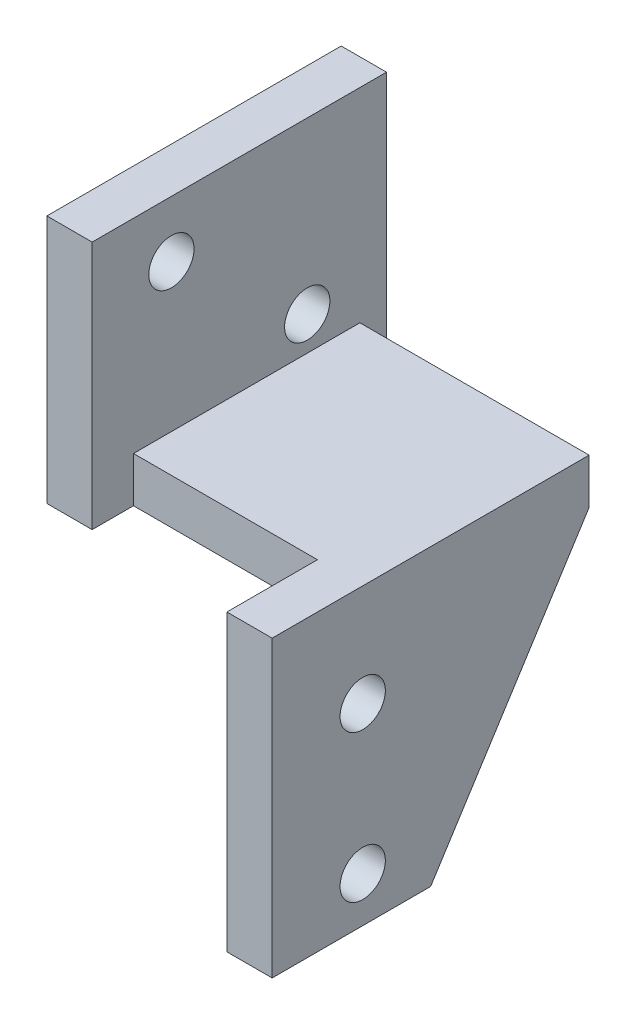
ISO-10303-21;
HEADER;
FILE_DESCRIPTION(('STEP AP214'),'2;1');
FILE_NAME('part.step','',(''),(''),'','','');
FILE_SCHEMA(('AUTOMOTIVE_DESIGN { 1 0 10303 214 1 1 1 1 }'));
ENDSEC;
DATA;
#1=APPLICATION_CONTEXT('core data for automotive mechanical design processes');
#2=APPLICATION_PROTOCOL_DEFINITION('international standard','automotive_design',2000,#1);
#3=PRODUCT_CONTEXT('',#1,'mechanical');
#4=PRODUCT('Part','Part','',(#3));
#5=PRODUCT_RELATED_PRODUCT_CATEGORY('part','',(#4));
#6=PRODUCT_DEFINITION_FORMATION('','',#4);
#7=PRODUCT_DEFINITION_CONTEXT('part definition',#1,'design');
#8=PRODUCT_DEFINITION('design','',#6,#7);
#9=PRODUCT_DEFINITION_SHAPE('','',#8);
#10=(LENGTH_UNIT() NAMED_UNIT(*) SI_UNIT(.MILLI.,.METRE.));
#11=(NAMED_UNIT(*) PLANE_ANGLE_UNIT() SI_UNIT($,.RADIAN.));
#12=(NAMED_UNIT(*) SI_UNIT($,.STERADIAN.) SOLID_ANGLE_UNIT());
#13=UNCERTAINTY_MEASURE_WITH_UNIT(LENGTH_MEASURE(1.E-05),#10,'distance_accuracy_value','');
#14=(GEOMETRIC_REPRESENTATION_CONTEXT(3) GLOBAL_UNCERTAINTY_ASSIGNED_CONTEXT((#13)) GLOBAL_UNIT_ASSIGNED_CONTEXT((#10,
#11,#12)) REPRESENTATION_CONTEXT('',''));
#15=CARTESIAN_POINT('',(0.,0.,0.));
#16=DIRECTION('',(0.,0.,1.));
#17=DIRECTION('',(1.,0.,0.));
#18=AXIS2_PLACEMENT_3D('',#15,#16,#17);
#19=CARTESIAN_POINT('',(0.,0.,20.));
#20=DIRECTION('',(0.,0.,1.));
#21=DIRECTION('',(1.,0.,0.));
#22=AXIS2_PLACEMENT_3D('',#19,#20,#21);
#23=PLANE('',#22);
#24=DIRECTION('',(1.,0.,0.));
#25=VECTOR('',#24,1.);
#26=CARTESIAN_POINT('',(0.,-2.,20.));
#27=LINE('',#26,#25);
#28=CARTESIAN_POINT('',(4.,-2.,20.));
#29=VERTEX_POINT('',#28);
#30=CARTESIAN_POINT('',(20.25,-2.,20.));
#31=VERTEX_POINT('',#30);
#32=EDGE_CURVE('E175',#29,#31,#27,.T.);
#33=ORIENTED_EDGE('',*,*,#32,.T.);
#34=DIRECTION('',(0.,-1.,0.));
#35=VECTOR('',#34,1.);
#36=CARTESIAN_POINT('',(20.25,-24.,20.));
#37=LINE('',#36,#35);
#38=CARTESIAN_POINT('',(20.25,2.,20.));
#39=VERTEX_POINT('',#38);
#40=EDGE_CURVE('E249',#39,#31,#37,.T.);
#41=ORIENTED_EDGE('',*,*,#40,.F.);
#42=DIRECTION('',(1.,0.,0.));
#43=VECTOR('',#42,1.);
#44=CARTESIAN_POINT('',(0.,2.,20.));
#45=LINE('',#44,#43);
#46=CARTESIAN_POINT('',(4.,2.,20.));
#47=VERTEX_POINT('',#46);
#48=EDGE_CURVE('E172',#47,#39,#45,.T.);
#49=ORIENTED_EDGE('',*,*,#48,.F.);
#50=DIRECTION('',(0.,1.,0.));
#51=VECTOR('',#50,1.);
#52=CARTESIAN_POINT('',(4.,16.,20.));
#53=LINE('',#52,#51);
#54=EDGE_CURVE('E243',#29,#47,#53,.T.);
#55=ORIENTED_EDGE('',*,*,#54,.F.);
#56=EDGE_LOOP('',(#33,#41,#49,#55));
#57=FACE_BOUND('',#56,.T.);
#58=ADVANCED_FACE('F43',(#57),#23,.T.);
#59=CARTESIAN_POINT('',(4.,0.,20.));
#60=DIRECTION('',(1.,0.,0.));
#61=DIRECTION('',(0.,1.,0.));
#62=AXIS2_PLACEMENT_3D('',#59,#60,#61);
#63=PLANE('',#62);
#64=CARTESIAN_POINT('',(4.,15.,16.65));
#65=DIRECTION('',(1.,0.,0.));
#66=DIRECTION('',(0.,1.,0.));
#67=AXIS2_PLACEMENT_3D('',#64,#65,#66);
#68=CIRCLE('',#67,2.);
#69=CARTESIAN_POINT('',(4.,17.,16.65));
#70=VERTEX_POINT('',#69);
#71=EDGE_CURVE('E241',#70,#70,#68,.T.);
#72=ORIENTED_EDGE('',*,*,#71,.F.);
#73=EDGE_LOOP('',(#72));
#74=FACE_BOUND('',#73,.T.);
#75=DIRECTION('',(0.,1.,0.));
#76=VECTOR('',#75,1.);
#77=CARTESIAN_POINT('',(4.,0.,-2.35));
#78=LINE('',#77,#76);
#79=CARTESIAN_POINT('',(4.,-2.,-2.35));
#80=VERTEX_POINT('',#79);
#81=CARTESIAN_POINT('',(4.,20.,-2.35));
#82=VERTEX_POINT('',#81);
#83=EDGE_CURVE('E65',#80,#82,#78,.T.);
#84=ORIENTED_EDGE('',*,*,#83,.T.);
#85=DIRECTION('',(0.,0.,-1.));
#86=VECTOR('',#85,1.);
#87=CARTESIAN_POINT('',(4.,20.,-2.35));
#88=LINE('',#87,#86);
#89=CARTESIAN_POINT('',(4.,20.,23.65));
#90=VERTEX_POINT('',#89);
#91=EDGE_CURVE('E205',#90,#82,#88,.T.);
#92=ORIENTED_EDGE('',*,*,#91,.F.);
#93=DIRECTION('',(0.,1.,0.));
#94=VECTOR('',#93,1.);
#95=CARTESIAN_POINT('',(4.,0.,23.65));
#96=LINE('',#95,#94);
#97=CARTESIAN_POINT('',(4.,-2.,23.65));
#98=VERTEX_POINT('',#97);
#99=EDGE_CURVE('E207',#98,#90,#96,.T.);
#100=ORIENTED_EDGE('',*,*,#99,.F.);
#101=DIRECTION('',(0.,0.,-1.));
#102=VECTOR('',#101,1.);
#103=CARTESIAN_POINT('',(4.,-2.,40.));
#104=LINE('',#103,#102);
#105=EDGE_CURVE('E167',#98,#29,#104,.T.);
#106=ORIENTED_EDGE('',*,*,#105,.T.);
#107=ORIENTED_EDGE('',*,*,#54,.T.);
#108=DIRECTION('',(0.,0.,-1.));
#109=VECTOR('',#108,1.);
#110=CARTESIAN_POINT('',(4.,2.,20.));
#111=LINE('',#110,#109);
#112=CARTESIAN_POINT('',(4.,2.,0.));
#113=VERTEX_POINT('',#112);
#114=EDGE_CURVE('E157',#47,#113,#111,.T.);
#115=ORIENTED_EDGE('',*,*,#114,.T.);
#116=DIRECTION('',(0.,-1.,0.));
#117=VECTOR('',#116,1.);
#118=CARTESIAN_POINT('',(4.,16.,0.));
#119=LINE('',#118,#117);
#120=CARTESIAN_POINT('',(4.,-2.,0.));
#121=VERTEX_POINT('',#120);
#122=EDGE_CURVE('E51',#113,#121,#119,.T.);
#123=ORIENTED_EDGE('',*,*,#122,.T.);
#124=DIRECTION('',(0.,0.,1.));
#125=VECTOR('',#124,1.);
#126=CARTESIAN_POINT('',(4.,-2.,-20.));
#127=LINE('',#126,#125);
#128=EDGE_CURVE('E169',#80,#121,#127,.T.);
#129=ORIENTED_EDGE('',*,*,#128,.F.);
#130=EDGE_LOOP('',(#84,#92,#100,#106,#107,#115,#123,#129));
#131=FACE_BOUND('',#130,.T.);
#132=CARTESIAN_POINT('',(4.,5.,4.65));
#133=DIRECTION('',(1.,0.,0.));
#134=DIRECTION('',(0.,1.,0.));
#135=AXIS2_PLACEMENT_3D('',#132,#133,#134);
#136=CIRCLE('',#135,2.);
#137=CARTESIAN_POINT('',(4.,7.,4.65));
#138=VERTEX_POINT('',#137);
#139=EDGE_CURVE('E206',#138,#138,#136,.T.);
#140=ORIENTED_EDGE('',*,*,#139,.F.);
#141=EDGE_LOOP('',(#140));
#142=FACE_BOUND('',#141,.T.);
#143=ADVANCED_FACE('F200',(#74,#131,#142),#63,.T.);
#144=CARTESIAN_POINT('',(0.,0.,20.));
#145=DIRECTION('',(-1.,0.,0.));
#146=DIRECTION('',(0.,0.,1.));
#147=AXIS2_PLACEMENT_3D('',#144,#145,#146);
#148=PLANE('',#147);
#149=CARTESIAN_POINT('',(0.,15.,16.65));
#150=DIRECTION('',(-1.,0.,0.));
#151=DIRECTION('',(0.,0.,1.));
#152=AXIS2_PLACEMENT_3D('',#149,#150,#151);
#153=CIRCLE('',#152,2.);
#154=CARTESIAN_POINT('',(0.,15.,18.65));
#155=VERTEX_POINT('',#154);
#156=EDGE_CURVE('E225',#155,#155,#153,.T.);
#157=ORIENTED_EDGE('',*,*,#156,.F.);
#158=EDGE_LOOP('',(#157));
#159=FACE_BOUND('',#158,.T.);
#160=DIRECTION('',(0.,0.,1.));
#161=VECTOR('',#160,1.);
#162=CARTESIAN_POINT('',(0.,20.,-2.35));
#163=LINE('',#162,#161);
#164=CARTESIAN_POINT('',(0.,20.,-2.35));
#165=VERTEX_POINT('',#164);
#166=CARTESIAN_POINT('',(0.,20.,23.65));
#167=VERTEX_POINT('',#166);
#168=EDGE_CURVE('E266',#165,#167,#163,.T.);
#169=ORIENTED_EDGE('',*,*,#168,.F.);
#170=DIRECTION('',(0.,-1.,0.));
#171=VECTOR('',#170,1.);
#172=CARTESIAN_POINT('',(0.,0.,-2.35));
#173=LINE('',#172,#171);
#174=CARTESIAN_POINT('',(0.,-2.,-2.35));
#175=VERTEX_POINT('',#174);
#176=EDGE_CURVE('E221',#165,#175,#173,.T.);
#177=ORIENTED_EDGE('',*,*,#176,.T.);
#178=DIRECTION('',(0.,0.,-1.));
#179=VECTOR('',#178,1.);
#180=CARTESIAN_POINT('',(0.,-2.,20.));
#181=LINE('',#180,#179);
#182=CARTESIAN_POINT('',(0.,-2.,23.65));
#183=VERTEX_POINT('',#182);
#184=EDGE_CURVE('E150',#183,#175,#181,.T.);
#185=ORIENTED_EDGE('',*,*,#184,.F.);
#186=DIRECTION('',(0.,-1.,0.));
#187=VECTOR('',#186,1.);
#188=CARTESIAN_POINT('',(0.,0.,23.65));
#189=LINE('',#188,#187);
#190=EDGE_CURVE('E232',#167,#183,#189,.T.);
#191=ORIENTED_EDGE('',*,*,#190,.F.);
#192=EDGE_LOOP('',(#169,#177,#185,#191));
#193=FACE_BOUND('',#192,.T.);
#194=CARTESIAN_POINT('',(0.,5.,4.65));
#195=DIRECTION('',(-1.,0.,0.));
#196=DIRECTION('',(0.,0.,1.));
#197=AXIS2_PLACEMENT_3D('',#194,#195,#196);
#198=CIRCLE('',#197,2.);
#199=CARTESIAN_POINT('',(0.,5.,6.65));
#200=VERTEX_POINT('',#199);
#201=EDGE_CURVE('E222',#200,#200,#198,.T.);
#202=ORIENTED_EDGE('',*,*,#201,.F.);
#203=EDGE_LOOP('',(#202));
#204=FACE_BOUND('',#203,.T.);
#205=ADVANCED_FACE('F276',(#159,#193,#204),#148,.T.);
#206=CARTESIAN_POINT('',(0.,-2.,20.));
#207=DIRECTION('',(0.,1.,0.));
#208=DIRECTION('',(0.,0.,1.));
#209=AXIS2_PLACEMENT_3D('',#206,#207,#208);
#210=PLANE('',#209);
#211=DIRECTION('',(-1.,0.,0.));
#212=VECTOR('',#211,1.);
#213=CARTESIAN_POINT('',(20.,-2.,-2.35));
#214=LINE('',#213,#212);
#215=EDGE_CURVE('E199',#80,#175,#214,.T.);
#216=ORIENTED_EDGE('',*,*,#215,.F.);
#217=ORIENTED_EDGE('',*,*,#128,.T.);
#218=DIRECTION('',(1.,0.,0.));
#219=VECTOR('',#218,1.);
#220=CARTESIAN_POINT('',(0.,-2.,0.));
#221=LINE('',#220,#219);
#222=CARTESIAN_POINT('',(20.25,-2.,0.));
#223=VERTEX_POINT('',#222);
#224=EDGE_CURVE('E181',#121,#223,#221,.T.);
#225=ORIENTED_EDGE('',*,*,#224,.T.);
#226=DIRECTION('',(0.,0.,-1.));
#227=VECTOR('',#226,1.);
#228=CARTESIAN_POINT('',(20.25,-2.,20.));
#229=LINE('',#228,#227);
#230=EDGE_CURVE('E142',#31,#223,#229,.T.);
#231=ORIENTED_EDGE('',*,*,#230,.F.);
#232=ORIENTED_EDGE('',*,*,#32,.F.);
#233=ORIENTED_EDGE('',*,*,#105,.F.);
#234=DIRECTION('',(-1.,0.,0.));
#235=VECTOR('',#234,1.);
#236=CARTESIAN_POINT('',(20.,-2.,23.65));
#237=LINE('',#236,#235);
#238=EDGE_CURVE('E230',#98,#183,#237,.T.);
#239=ORIENTED_EDGE('',*,*,#238,.T.);
#240=ORIENTED_EDGE('',*,*,#184,.T.);
#241=EDGE_LOOP('',(#216,#217,#225,#231,#232,#233,#239,#240));
#242=FACE_BOUND('',#241,.T.);
#243=ADVANCED_FACE('F197',(#242),#210,.F.);
#244=CARTESIAN_POINT('',(0.,0.,0.));
#245=DIRECTION('',(0.,0.,1.));
#246=DIRECTION('',(1.,0.,0.));
#247=AXIS2_PLACEMENT_3D('',#244,#245,#246);
#248=PLANE('',#247);
#249=DIRECTION('',(0.,1.,0.));
#250=VECTOR('',#249,1.);
#251=CARTESIAN_POINT('',(24.25,0.,0.));
#252=LINE('',#251,#250);
#253=CARTESIAN_POINT('',(24.25,-2.00000000000001,0.));
#254=VERTEX_POINT('',#253);
#255=CARTESIAN_POINT('',(24.25,2.,0.));
#256=VERTEX_POINT('',#255);
#257=EDGE_CURVE('E176',#254,#256,#252,.T.);
#258=ORIENTED_EDGE('',*,*,#257,.F.);
#259=DIRECTION('',(-1.,0.,0.));
#260=VECTOR('',#259,1.);
#261=CARTESIAN_POINT('',(28.25,-2.,0.));
#262=LINE('',#261,#260);
#263=EDGE_CURVE('E58',#254,#223,#262,.T.);
#264=ORIENTED_EDGE('',*,*,#263,.T.);
#265=ORIENTED_EDGE('',*,*,#224,.F.);
#266=ORIENTED_EDGE('',*,*,#122,.F.);
#267=DIRECTION('',(1.,0.,0.));
#268=VECTOR('',#267,1.);
#269=CARTESIAN_POINT('',(0.,2.,0.));
#270=LINE('',#269,#268);
#271=EDGE_CURVE('E171',#113,#256,#270,.T.);
#272=ORIENTED_EDGE('',*,*,#271,.T.);
#273=EDGE_LOOP('',(#258,#264,#265,#266,#272));
#274=FACE_BOUND('',#273,.T.);
#275=ADVANCED_FACE('F194',(#274),#248,.F.);
#276=CARTESIAN_POINT('',(0.,2.,20.));
#277=DIRECTION('',(0.,1.,0.));
#278=DIRECTION('',(0.,0.,1.));
#279=AXIS2_PLACEMENT_3D('',#276,#277,#278);
#280=PLANE('',#279);
#281=ORIENTED_EDGE('',*,*,#271,.F.);
#282=ORIENTED_EDGE('',*,*,#114,.F.);
#283=ORIENTED_EDGE('',*,*,#48,.T.);
#284=DIRECTION('',(0.,0.,-1.));
#285=VECTOR('',#284,1.);
#286=CARTESIAN_POINT('',(20.25,2.,28.));
#287=LINE('',#286,#285);
#288=CARTESIAN_POINT('',(20.25,2.,28.));
#289=VERTEX_POINT('',#288);
#290=EDGE_CURVE('E250',#289,#39,#287,.T.);
#291=ORIENTED_EDGE('',*,*,#290,.F.);
#292=DIRECTION('',(-1.,0.,0.));
#293=VECTOR('',#292,1.);
#294=CARTESIAN_POINT('',(20.25,2.,28.));
#295=LINE('',#294,#293);
#296=CARTESIAN_POINT('',(24.25,2.,28.));
#297=VERTEX_POINT('',#296);
#298=EDGE_CURVE('E188',#297,#289,#295,.T.);
#299=ORIENTED_EDGE('',*,*,#298,.F.);
#300=DIRECTION('',(0.,0.,-1.));
#301=VECTOR('',#300,1.);
#302=CARTESIAN_POINT('',(24.25,2.,20.));
#303=LINE('',#302,#301);
#304=EDGE_CURVE('E152',#297,#256,#303,.T.);
#305=ORIENTED_EDGE('',*,*,#304,.T.);
#306=EDGE_LOOP('',(#281,#282,#283,#291,#299,#305));
#307=FACE_BOUND('',#306,.T.);
#308=ADVANCED_FACE('F45',(#307),#280,.T.);
#309=CARTESIAN_POINT('',(20.25,0.,20.));
#310=DIRECTION('',(-1.,0.,0.));
#311=DIRECTION('',(0.,-1.,0.));
#312=AXIS2_PLACEMENT_3D('',#309,#310,#311);
#313=PLANE('',#312);
#314=DIRECTION('',(0.,0.843661487732107,-0.536875492193159));
#315=VECTOR('',#314,1.);
#316=CARTESIAN_POINT('',(20.25,-0.576470588235294,-0.90588235294118));
#317=LINE('',#316,#315);
#318=CARTESIAN_POINT('',(20.25,-24.,14.));
#319=VERTEX_POINT('',#318);
#320=EDGE_CURVE('E129',#319,#223,#317,.T.);
#321=ORIENTED_EDGE('',*,*,#320,.F.);
#322=DIRECTION('',(0.,0.,-1.));
#323=VECTOR('',#322,1.);
#324=CARTESIAN_POINT('',(20.25,-24.,20.));
#325=LINE('',#324,#323);
#326=CARTESIAN_POINT('',(20.25,-24.,28.));
#327=VERTEX_POINT('',#326);
#328=EDGE_CURVE('E139',#327,#319,#325,.T.);
#329=ORIENTED_EDGE('',*,*,#328,.F.);
#330=DIRECTION('',(0.,-1.,0.));
#331=VECTOR('',#330,1.);
#332=CARTESIAN_POINT('',(20.25,-24.,28.));
#333=LINE('',#332,#331);
#334=EDGE_CURVE('E253',#289,#327,#333,.T.);
#335=ORIENTED_EDGE('',*,*,#334,.F.);
#336=ORIENTED_EDGE('',*,*,#290,.T.);
#337=ORIENTED_EDGE('',*,*,#40,.T.);
#338=ORIENTED_EDGE('',*,*,#230,.T.);
#339=EDGE_LOOP('',(#321,#329,#335,#336,#337,#338));
#340=FACE_BOUND('',#339,.T.);
#341=CARTESIAN_POINT('',(20.25,-20.,20.));
#342=DIRECTION('',(-1.,0.,0.));
#343=DIRECTION('',(0.,-1.,0.));
#344=AXIS2_PLACEMENT_3D('',#341,#342,#343);
#345=CIRCLE('',#344,2.);
#346=CARTESIAN_POINT('',(20.25,-22.,20.));
#347=VERTEX_POINT('',#346);
#348=EDGE_CURVE('E270',#347,#347,#345,.T.);
#349=ORIENTED_EDGE('',*,*,#348,.F.);
#350=EDGE_LOOP('',(#349));
#351=FACE_BOUND('',#350,.T.);
#352=CARTESIAN_POINT('',(20.25,-7.,20.));
#353=DIRECTION('',(-1.,0.,0.));
#354=DIRECTION('',(0.,-1.,0.));
#355=AXIS2_PLACEMENT_3D('',#352,#353,#354);
#356=CIRCLE('',#355,2.);
#357=CARTESIAN_POINT('',(20.25,-9.,20.));
#358=VERTEX_POINT('',#357);
#359=EDGE_CURVE('E267',#358,#358,#356,.T.);
#360=ORIENTED_EDGE('',*,*,#359,.F.);
#361=EDGE_LOOP('',(#360));
#362=FACE_BOUND('',#361,.T.);
#363=ADVANCED_FACE('F136',(#340,#351,#362),#313,.T.);
#364=CARTESIAN_POINT('',(0.,-24.,20.));
#365=DIRECTION('',(0.,1.,0.));
#366=DIRECTION('',(0.,0.,1.));
#367=AXIS2_PLACEMENT_3D('',#364,#365,#366);
#368=PLANE('',#367);
#369=ORIENTED_EDGE('',*,*,#328,.T.);
#370=DIRECTION('',(-1.,0.,0.));
#371=VECTOR('',#370,1.);
#372=CARTESIAN_POINT('',(28.25,-24.,14.));
#373=LINE('',#372,#371);
#374=CARTESIAN_POINT('',(24.25,-24.,14.));
#375=VERTEX_POINT('',#374);
#376=EDGE_CURVE('E126',#375,#319,#373,.T.);
#377=ORIENTED_EDGE('',*,*,#376,.F.);
#378=DIRECTION('',(0.,0.,-1.));
#379=VECTOR('',#378,1.);
#380=CARTESIAN_POINT('',(24.25,-24.,20.));
#381=LINE('',#380,#379);
#382=CARTESIAN_POINT('',(24.25,-24.,28.));
#383=VERTEX_POINT('',#382);
#384=EDGE_CURVE('E148',#383,#375,#381,.T.);
#385=ORIENTED_EDGE('',*,*,#384,.F.);
#386=DIRECTION('',(1.,0.,0.));
#387=VECTOR('',#386,1.);
#388=CARTESIAN_POINT('',(20.25,-24.,28.));
#389=LINE('',#388,#387);
#390=EDGE_CURVE('E146',#327,#383,#389,.T.);
#391=ORIENTED_EDGE('',*,*,#390,.F.);
#392=EDGE_LOOP('',(#369,#377,#385,#391));
#393=FACE_BOUND('',#392,.T.);
#394=ADVANCED_FACE('F144',(#393),#368,.F.);
#395=CARTESIAN_POINT('',(24.25,0.,20.));
#396=DIRECTION('',(-1.,0.,0.));
#397=DIRECTION('',(0.,0.,1.));
#398=AXIS2_PLACEMENT_3D('',#395,#396,#397);
#399=PLANE('',#398);
#400=ORIENTED_EDGE('',*,*,#384,.T.);
#401=DIRECTION('',(0.,0.843661487732107,-0.536875492193159));
#402=VECTOR('',#401,1.);
#403=CARTESIAN_POINT('',(24.25,-9.63529411764706,4.85882352941176));
#404=LINE('',#403,#402);
#405=EDGE_CURVE('E11',#375,#254,#404,.T.);
#406=ORIENTED_EDGE('',*,*,#405,.T.);
#407=ORIENTED_EDGE('',*,*,#257,.T.);
#408=ORIENTED_EDGE('',*,*,#304,.F.);
#409=DIRECTION('',(0.,1.,0.));
#410=VECTOR('',#409,1.);
#411=CARTESIAN_POINT('',(24.25,-24.,28.));
#412=LINE('',#411,#410);
#413=EDGE_CURVE('E256',#383,#297,#412,.T.);
#414=ORIENTED_EDGE('',*,*,#413,.F.);
#415=EDGE_LOOP('',(#400,#406,#407,#408,#414));
#416=FACE_BOUND('',#415,.T.);
#417=CARTESIAN_POINT('',(24.25,-7.,20.));
#418=DIRECTION('',(-1.,0.,0.));
#419=DIRECTION('',(0.,-1.,0.));
#420=AXIS2_PLACEMENT_3D('',#417,#418,#419);
#421=CIRCLE('',#420,2.);
#422=CARTESIAN_POINT('',(24.25,-9.,20.));
#423=VERTEX_POINT('',#422);
#424=EDGE_CURVE('E263',#423,#423,#421,.T.);
#425=ORIENTED_EDGE('',*,*,#424,.T.);
#426=EDGE_LOOP('',(#425));
#427=FACE_BOUND('',#426,.T.);
#428=CARTESIAN_POINT('',(24.25,-20.,20.));
#429=DIRECTION('',(-1.,0.,0.));
#430=DIRECTION('',(0.,-1.,0.));
#431=AXIS2_PLACEMENT_3D('',#428,#429,#430);
#432=CIRCLE('',#431,2.);
#433=CARTESIAN_POINT('',(24.25,-22.,20.));
#434=VERTEX_POINT('',#433);
#435=EDGE_CURVE('E251',#434,#434,#432,.T.);
#436=ORIENTED_EDGE('',*,*,#435,.T.);
#437=EDGE_LOOP('',(#436));
#438=FACE_BOUND('',#437,.T.);
#439=ADVANCED_FACE('F282',(#416,#427,#438),#399,.F.);
#440=CARTESIAN_POINT('',(20.,0.,23.65));
#441=DIRECTION('',(0.,0.,-1.));
#442=DIRECTION('',(0.,1.,0.));
#443=AXIS2_PLACEMENT_3D('',#440,#441,#442);
#444=PLANE('',#443);
#445=ORIENTED_EDGE('',*,*,#99,.T.);
#446=DIRECTION('',(1.,0.,0.));
#447=VECTOR('',#446,1.);
#448=CARTESIAN_POINT('',(0.,20.,23.65));
#449=LINE('',#448,#447);
#450=EDGE_CURVE('E217',#167,#90,#449,.T.);
#451=ORIENTED_EDGE('',*,*,#450,.F.);
#452=ORIENTED_EDGE('',*,*,#190,.T.);
#453=ORIENTED_EDGE('',*,*,#238,.F.);
#454=EDGE_LOOP('',(#445,#451,#452,#453));
#455=FACE_BOUND('',#454,.T.);
#456=ADVANCED_FACE('F280',(#455),#444,.F.);
#457=CARTESIAN_POINT('',(20.,0.,-2.35));
#458=DIRECTION('',(0.,0.,-1.));
#459=DIRECTION('',(0.,1.,0.));
#460=AXIS2_PLACEMENT_3D('',#457,#458,#459);
#461=PLANE('',#460);
#462=ORIENTED_EDGE('',*,*,#215,.T.);
#463=ORIENTED_EDGE('',*,*,#176,.F.);
#464=DIRECTION('',(-1.,0.,0.));
#465=VECTOR('',#464,1.);
#466=CARTESIAN_POINT('',(0.,20.,-2.35));
#467=LINE('',#466,#465);
#468=EDGE_CURVE('E214',#82,#165,#467,.T.);
#469=ORIENTED_EDGE('',*,*,#468,.F.);
#470=ORIENTED_EDGE('',*,*,#83,.F.);
#471=EDGE_LOOP('',(#462,#463,#469,#470));
#472=FACE_BOUND('',#471,.T.);
#473=ADVANCED_FACE('F219',(#472),#461,.T.);
#474=CARTESIAN_POINT('',(20.,5.,4.65));
#475=DIRECTION('',(-1.,0.,0.));
#476=DIRECTION('',(0.,0.,1.));
#477=AXIS2_PLACEMENT_3D('',#474,#475,#476);
#478=CYLINDRICAL_SURFACE('',#477,2.);
#479=ORIENTED_EDGE('',*,*,#139,.T.);
#480=EDGE_LOOP('',(#479));
#481=FACE_BOUND('',#480,.T.);
#482=ORIENTED_EDGE('',*,*,#201,.T.);
#483=EDGE_LOOP('',(#482));
#484=FACE_BOUND('',#483,.T.);
#485=ADVANCED_FACE('F288',(#481,#484),#478,.F.);
#486=CARTESIAN_POINT('',(20.,15.,16.65));
#487=DIRECTION('',(-1.,0.,0.));
#488=DIRECTION('',(0.,0.,1.));
#489=AXIS2_PLACEMENT_3D('',#486,#487,#488);
#490=CYLINDRICAL_SURFACE('',#489,2.);
#491=ORIENTED_EDGE('',*,*,#156,.T.);
#492=EDGE_LOOP('',(#491));
#493=FACE_BOUND('',#492,.T.);
#494=ORIENTED_EDGE('',*,*,#71,.T.);
#495=EDGE_LOOP('',(#494));
#496=FACE_BOUND('',#495,.T.);
#497=ADVANCED_FACE('F314',(#493,#496),#490,.F.);
#498=CARTESIAN_POINT('',(0.,20.,0.));
#499=DIRECTION('',(0.,1.,0.));
#500=DIRECTION('',(0.,0.,1.));
#501=AXIS2_PLACEMENT_3D('',#498,#499,#500);
#502=PLANE('',#501);
#503=ORIENTED_EDGE('',*,*,#168,.T.);
#504=ORIENTED_EDGE('',*,*,#450,.T.);
#505=ORIENTED_EDGE('',*,*,#91,.T.);
#506=ORIENTED_EDGE('',*,*,#468,.T.);
#507=EDGE_LOOP('',(#503,#504,#505,#506));
#508=FACE_BOUND('',#507,.T.);
#509=ADVANCED_FACE('F213',(#508),#502,.T.);
#510=CARTESIAN_POINT('',(24.25,-20.,20.));
#511=DIRECTION('',(-1.,0.,0.));
#512=DIRECTION('',(0.,-1.,0.));
#513=AXIS2_PLACEMENT_3D('',#510,#511,#512);
#514=CYLINDRICAL_SURFACE('',#513,2.);
#515=ORIENTED_EDGE('',*,*,#435,.F.);
#516=EDGE_LOOP('',(#515));
#517=FACE_BOUND('',#516,.T.);
#518=ORIENTED_EDGE('',*,*,#348,.T.);
#519=EDGE_LOOP('',(#518));
#520=FACE_BOUND('',#519,.T.);
#521=ADVANCED_FACE('F322',(#517,#520),#514,.F.);
#522=CARTESIAN_POINT('',(24.25,-7.,20.));
#523=DIRECTION('',(-1.,0.,0.));
#524=DIRECTION('',(0.,-1.,0.));
#525=AXIS2_PLACEMENT_3D('',#522,#523,#524);
#526=CYLINDRICAL_SURFACE('',#525,2.);
#527=ORIENTED_EDGE('',*,*,#424,.F.);
#528=EDGE_LOOP('',(#527));
#529=FACE_BOUND('',#528,.T.);
#530=ORIENTED_EDGE('',*,*,#359,.T.);
#531=EDGE_LOOP('',(#530));
#532=FACE_BOUND('',#531,.T.);
#533=ADVANCED_FACE('F388',(#529,#532),#526,.F.);
#534=CARTESIAN_POINT('',(0.,0.,28.));
#535=DIRECTION('',(0.,0.,-1.));
#536=DIRECTION('',(-1.,0.,0.));
#537=AXIS2_PLACEMENT_3D('',#534,#535,#536);
#538=PLANE('',#537);
#539=ORIENTED_EDGE('',*,*,#334,.T.);
#540=ORIENTED_EDGE('',*,*,#390,.T.);
#541=ORIENTED_EDGE('',*,*,#413,.T.);
#542=ORIENTED_EDGE('',*,*,#298,.T.);
#543=EDGE_LOOP('',(#539,#540,#541,#542));
#544=FACE_BOUND('',#543,.T.);
#545=ADVANCED_FACE('F383',(#544),#538,.F.);
#546=CARTESIAN_POINT('',(28.25,-0.576470588235293,-0.90588235294118));
#547=DIRECTION('',(0.,0.536875492193159,0.843661487732107));
#548=DIRECTION('',(0.,-0.843661487732107,0.536875492193159));
#549=AXIS2_PLACEMENT_3D('',#546,#547,#548);
#550=PLANE('',#549);
#551=ORIENTED_EDGE('',*,*,#376,.T.);
#552=ORIENTED_EDGE('',*,*,#320,.T.);
#553=ORIENTED_EDGE('',*,*,#263,.F.);
#554=ORIENTED_EDGE('',*,*,#405,.F.);
#555=EDGE_LOOP('',(#551,#552,#553,#554));
#556=FACE_BOUND('',#555,.T.);
#557=ADVANCED_FACE('F128',(#556),#550,.F.);
#558=CLOSED_SHELL('',(#58,#143,#205,#243,#275,#308,#363,#394,#439,#456,#473,#485,#497,#509,#521,
#533,#545,#557));
#559=MANIFOLD_SOLID_BREP('B2',#558);
#560=ADVANCED_BREP_SHAPE_REPRESENTATION('',(#18,#559),#14);
#561=SHAPE_DEFINITION_REPRESENTATION(#9,#560);
ENDSEC;
END-ISO-10303-21;
